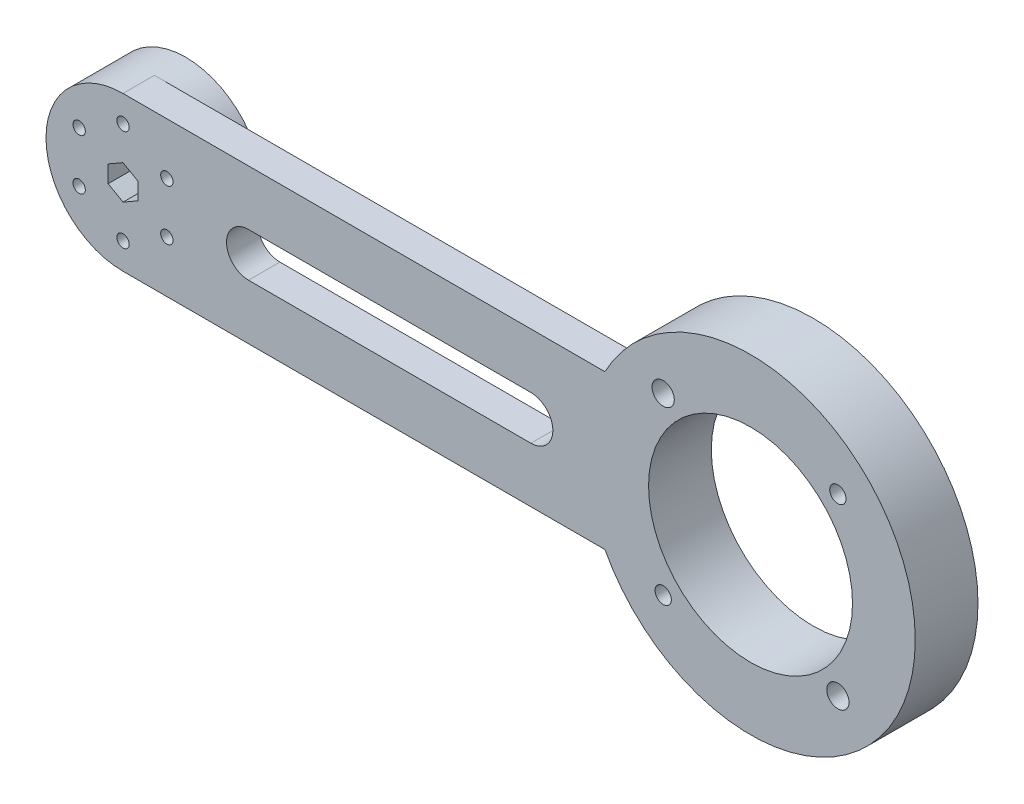
ISO-10303-21;
HEADER;
FILE_DESCRIPTION(('STEP AP214'),'2;1');
FILE_NAME('part.step','',(''),(''),'','','');
FILE_SCHEMA(('AUTOMOTIVE_DESIGN { 1 0 10303 214 1 1 1 1 }'));
ENDSEC;
DATA;
#1=APPLICATION_CONTEXT('core data for automotive mechanical design processes');
#2=APPLICATION_PROTOCOL_DEFINITION('international standard','automotive_design',2000,#1);
#3=PRODUCT_CONTEXT('',#1,'mechanical');
#4=PRODUCT('Part','Part','',(#3));
#5=PRODUCT_RELATED_PRODUCT_CATEGORY('part','',(#4));
#6=PRODUCT_DEFINITION_FORMATION('','',#4);
#7=PRODUCT_DEFINITION_CONTEXT('part definition',#1,'design');
#8=PRODUCT_DEFINITION('design','',#6,#7);
#9=PRODUCT_DEFINITION_SHAPE('','',#8);
#10=(LENGTH_UNIT() NAMED_UNIT(*) SI_UNIT(.MILLI.,.METRE.));
#11=(NAMED_UNIT(*) PLANE_ANGLE_UNIT() SI_UNIT($,.RADIAN.));
#12=(NAMED_UNIT(*) SI_UNIT($,.STERADIAN.) SOLID_ANGLE_UNIT());
#13=UNCERTAINTY_MEASURE_WITH_UNIT(LENGTH_MEASURE(1.E-05),#10,'distance_accuracy_value','');
#14=(GEOMETRIC_REPRESENTATION_CONTEXT(3) GLOBAL_UNCERTAINTY_ASSIGNED_CONTEXT((#13)) GLOBAL_UNIT_ASSIGNED_CONTEXT((#10,
#11,#12)) REPRESENTATION_CONTEXT('',''));
#15=CARTESIAN_POINT('',(0.,0.,0.));
#16=DIRECTION('',(0.,0.,1.));
#17=DIRECTION('',(1.,0.,0.));
#18=AXIS2_PLACEMENT_3D('',#15,#16,#17);
#19=CARTESIAN_POINT('',(6.18334947248386,-0.386154044925813,6.35));
#20=DIRECTION('',(0.,0.,-1.));
#21=DIRECTION('',(-1.,0.,0.));
#22=AXIS2_PLACEMENT_3D('',#19,#20,#21);
#23=CYLINDRICAL_SURFACE('',#22,4.445);
#24=CARTESIAN_POINT('',(6.18334947248386,-0.386154044925813,0.));
#25=DIRECTION('',(0.,0.,1.));
#26=DIRECTION('',(1.,0.,0.));
#27=AXIS2_PLACEMENT_3D('',#24,#25,#26);
#28=CIRCLE('',#27,4.445);
#29=CARTESIAN_POINT('',(6.18334947248386,-4.83115404492581,0.));
#30=VERTEX_POINT('',#29);
#31=CARTESIAN_POINT('',(6.18334947248386,4.05884595507418,0.));
#32=VERTEX_POINT('',#31);
#33=EDGE_CURVE('E193',#30,#32,#28,.T.);
#34=ORIENTED_EDGE('',*,*,#33,.F.);
#35=DIRECTION('',(0.,0.,-1.));
#36=VECTOR('',#35,1.);
#37=CARTESIAN_POINT('',(6.18334947248386,-4.83115404492581,6.35));
#38=LINE('',#37,#36);
#39=CARTESIAN_POINT('',(6.18334947248386,-4.83115404492581,6.35));
#40=VERTEX_POINT('',#39);
#41=EDGE_CURVE('E57',#40,#30,#38,.T.);
#42=ORIENTED_EDGE('',*,*,#41,.F.);
#43=CARTESIAN_POINT('',(6.18334947248386,-0.386154044925813,6.35));
#44=DIRECTION('',(0.,0.,1.));
#45=DIRECTION('',(1.,0.,0.));
#46=AXIS2_PLACEMENT_3D('',#43,#44,#45);
#47=CIRCLE('',#46,4.445);
#48=CARTESIAN_POINT('',(6.18334947248386,4.05884595507418,6.35));
#49=VERTEX_POINT('',#48);
#50=EDGE_CURVE('E153',#40,#49,#47,.T.);
#51=ORIENTED_EDGE('',*,*,#50,.T.);
#52=DIRECTION('',(0.,0.,-1.));
#53=VECTOR('',#52,1.);
#54=CARTESIAN_POINT('',(6.18334947248386,4.05884595507418,6.35));
#55=LINE('',#54,#53);
#56=EDGE_CURVE('E94',#49,#32,#55,.T.);
#57=ORIENTED_EDGE('',*,*,#56,.T.);
#58=EDGE_LOOP('',(#34,#42,#51,#57));
#59=FACE_BOUND('',#58,.T.);
#60=ADVANCED_FACE('F47',(#59),#23,.F.);
#61=CARTESIAN_POINT('',(0.,-4.83115404492581,6.35));
#62=DIRECTION('',(0.,1.,0.));
#63=DIRECTION('',(0.,0.,1.));
#64=AXIS2_PLACEMENT_3D('',#61,#62,#63);
#65=PLANE('',#64);
#66=DIRECTION('',(1.,0.,0.));
#67=VECTOR('',#66,1.);
#68=CARTESIAN_POINT('',(0.,-4.83115404492581,0.));
#69=LINE('',#68,#67);
#70=CARTESIAN_POINT('',(-50.9666505275162,-4.83115404492581,0.));
#71=VERTEX_POINT('',#70);
#72=EDGE_CURVE('E143',#71,#30,#69,.T.);
#73=ORIENTED_EDGE('',*,*,#72,.F.);
#74=DIRECTION('',(0.,0.,-1.));
#75=VECTOR('',#74,1.);
#76=CARTESIAN_POINT('',(-50.9666505275162,-4.83115404492581,6.35));
#77=LINE('',#76,#75);
#78=CARTESIAN_POINT('',(-50.9666505275162,-4.83115404492581,6.35));
#79=VERTEX_POINT('',#78);
#80=EDGE_CURVE('E138',#79,#71,#77,.T.);
#81=ORIENTED_EDGE('',*,*,#80,.F.);
#82=DIRECTION('',(1.,0.,0.));
#83=VECTOR('',#82,1.);
#84=CARTESIAN_POINT('',(0.,-4.83115404492581,6.35));
#85=LINE('',#84,#83);
#86=EDGE_CURVE('E141',#79,#40,#85,.T.);
#87=ORIENTED_EDGE('',*,*,#86,.T.);
#88=ORIENTED_EDGE('',*,*,#41,.T.);
#89=EDGE_LOOP('',(#73,#81,#87,#88));
#90=FACE_BOUND('',#89,.T.);
#91=ADVANCED_FACE('F140',(#90),#65,.T.);
#92=CARTESIAN_POINT('',(-50.9666505275162,-0.386154044925813,6.35));
#93=DIRECTION('',(0.,0.,-1.));
#94=DIRECTION('',(-1.,0.,0.));
#95=AXIS2_PLACEMENT_3D('',#92,#93,#94);
#96=CYLINDRICAL_SURFACE('',#95,4.445);
#97=CARTESIAN_POINT('',(-50.9666505275162,-0.386154044925813,0.));
#98=DIRECTION('',(0.,0.,1.));
#99=DIRECTION('',(1.,0.,0.));
#100=AXIS2_PLACEMENT_3D('',#97,#98,#99);
#101=CIRCLE('',#100,4.445);
#102=CARTESIAN_POINT('',(-50.9666505275162,4.05884595507418,0.));
#103=VERTEX_POINT('',#102);
#104=EDGE_CURVE('E199',#103,#71,#101,.T.);
#105=ORIENTED_EDGE('',*,*,#104,.F.);
#106=DIRECTION('',(0.,0.,-1.));
#107=VECTOR('',#106,1.);
#108=CARTESIAN_POINT('',(-50.9666505275162,4.05884595507418,6.35));
#109=LINE('',#108,#107);
#110=CARTESIAN_POINT('',(-50.9666505275162,4.05884595507418,6.35));
#111=VERTEX_POINT('',#110);
#112=EDGE_CURVE('E87',#111,#103,#109,.T.);
#113=ORIENTED_EDGE('',*,*,#112,.F.);
#114=CARTESIAN_POINT('',(-50.9666505275162,-0.386154044925813,6.35));
#115=DIRECTION('',(0.,0.,1.));
#116=DIRECTION('',(1.,0.,0.));
#117=AXIS2_PLACEMENT_3D('',#114,#115,#116);
#118=CIRCLE('',#117,4.445);
#119=EDGE_CURVE('E152',#111,#79,#118,.T.);
#120=ORIENTED_EDGE('',*,*,#119,.T.);
#121=ORIENTED_EDGE('',*,*,#80,.T.);
#122=EDGE_LOOP('',(#105,#113,#120,#121));
#123=FACE_BOUND('',#122,.T.);
#124=ADVANCED_FACE('F156',(#123),#96,.F.);
#125=CARTESIAN_POINT('',(-76.3666505275162,-0.386154044925813,6.35));
#126=DIRECTION('',(0.,0.,-1.));
#127=DIRECTION('',(-1.,0.,0.));
#128=AXIS2_PLACEMENT_3D('',#125,#126,#127);
#129=CYLINDRICAL_SURFACE('',#128,15.5847158734343);
#130=DIRECTION('',(0.,0.,-1.));
#131=VECTOR('',#130,1.);
#132=CARTESIAN_POINT('',(-76.3666505275162,15.1985618285085,6.35));
#133=LINE('',#132,#131);
#134=CARTESIAN_POINT('',(-76.3666505275162,15.1985618285085,6.35));
#135=VERTEX_POINT('',#134);
#136=CARTESIAN_POINT('',(-76.3666505275162,15.1985618285085,0.));
#137=VERTEX_POINT('',#136);
#138=EDGE_CURVE('E213',#135,#137,#133,.T.);
#139=ORIENTED_EDGE('',*,*,#138,.T.);
#140=CARTESIAN_POINT('',(-76.3666505275162,-0.386154044925813,0.));
#141=DIRECTION('',(0.,0.,1.));
#142=DIRECTION('',(1.,0.,0.));
#143=AXIS2_PLACEMENT_3D('',#140,#141,#142);
#144=CIRCLE('',#143,15.5847158734343);
#145=CARTESIAN_POINT('',(-76.3666505275162,-15.9708699183601,0.));
#146=VERTEX_POINT('',#145);
#147=EDGE_CURVE('E11',#146,#137,#144,.T.);
#148=ORIENTED_EDGE('',*,*,#147,.F.);
#149=DIRECTION('',(0.,0.,-1.));
#150=VECTOR('',#149,1.);
#151=CARTESIAN_POINT('',(-76.3666505275162,-15.9708699183601,6.35));
#152=LINE('',#151,#150);
#153=CARTESIAN_POINT('',(-76.3666505275162,-15.9708699183601,6.35));
#154=VERTEX_POINT('',#153);
#155=EDGE_CURVE('E208',#154,#146,#152,.T.);
#156=ORIENTED_EDGE('',*,*,#155,.F.);
#157=CARTESIAN_POINT('',(-76.3666505275162,-0.386154044925813,6.35));
#158=DIRECTION('',(0.,0.,1.));
#159=DIRECTION('',(1.,0.,0.));
#160=AXIS2_PLACEMENT_3D('',#157,#158,#159);
#161=CIRCLE('',#160,15.5847158734343);
#162=EDGE_CURVE('E368',#135,#154,#161,.T.);
#163=ORIENTED_EDGE('',*,*,#162,.F.);
#164=EDGE_LOOP('',(#139,#148,#156,#163));
#165=FACE_BOUND('',#164,.T.);
#166=CARTESIAN_POINT('',(-76.3666505275162,-0.386154044925813,-6.35));
#167=DIRECTION('',(0.,0.,1.));
#168=DIRECTION('',(1.,0.,0.));
#169=AXIS2_PLACEMENT_3D('',#166,#167,#168);
#170=CIRCLE('',#169,15.5847158734343);
#171=CARTESIAN_POINT('',(-60.7819346540819,-0.386154044925813,-6.35));
#172=VERTEX_POINT('',#171);
#173=EDGE_CURVE('E297',#172,#172,#170,.T.);
#174=ORIENTED_EDGE('',*,*,#173,.T.);
#175=EDGE_LOOP('',(#174));
#176=FACE_BOUND('',#175,.T.);
#177=ADVANCED_FACE('F416',(#165,#176),#129,.T.);
#178=CARTESIAN_POINT('',(0.,-15.9708699183601,6.35));
#179=DIRECTION('',(0.,1.,0.));
#180=DIRECTION('',(0.,0.,1.));
#181=AXIS2_PLACEMENT_3D('',#178,#179,#180);
#182=PLANE('',#181);
#183=DIRECTION('',(1.,0.,0.));
#184=VECTOR('',#183,1.);
#185=CARTESIAN_POINT('',(0.,-15.9708699183601,0.));
#186=LINE('',#185,#184);
#187=CARTESIAN_POINT('',(21.1629314674008,-15.9708699183601,0.));
#188=VERTEX_POINT('',#187);
#189=EDGE_CURVE('E184',#146,#188,#186,.T.);
#190=ORIENTED_EDGE('',*,*,#189,.T.);
#191=DIRECTION('',(0.,0.,-1.));
#192=VECTOR('',#191,1.);
#193=CARTESIAN_POINT('',(21.1629314674008,-15.9708699183601,6.35));
#194=LINE('',#193,#192);
#195=CARTESIAN_POINT('',(21.1629314674008,-15.9708699183601,6.35));
#196=VERTEX_POINT('',#195);
#197=EDGE_CURVE('E222',#196,#188,#194,.T.);
#198=ORIENTED_EDGE('',*,*,#197,.F.);
#199=DIRECTION('',(1.,0.,0.));
#200=VECTOR('',#199,1.);
#201=CARTESIAN_POINT('',(0.,-15.9708699183601,6.35));
#202=LINE('',#201,#200);
#203=EDGE_CURVE('E372',#154,#196,#202,.T.);
#204=ORIENTED_EDGE('',*,*,#203,.F.);
#205=ORIENTED_EDGE('',*,*,#155,.T.);
#206=EDGE_LOOP('',(#190,#198,#204,#205));
#207=FACE_BOUND('',#206,.T.);
#208=ADVANCED_FACE('F412',(#207),#182,.F.);
#209=CARTESIAN_POINT('',(50.6333494724839,-0.386154044925813,6.35));
#210=DIRECTION('',(0.,0.,-1.));
#211=DIRECTION('',(-1.,0.,0.));
#212=AXIS2_PLACEMENT_3D('',#209,#210,#211);
#213=CYLINDRICAL_SURFACE('',#212,33.3375);
#214=ORIENTED_EDGE('',*,*,#197,.T.);
#215=CARTESIAN_POINT('',(50.6333494724839,-0.386154044925813,0.));
#216=DIRECTION('',(0.,0.,1.));
#217=DIRECTION('',(1.,0.,0.));
#218=AXIS2_PLACEMENT_3D('',#215,#216,#217);
#219=CIRCLE('',#218,33.3375);
#220=CARTESIAN_POINT('',(21.1629314674008,15.1985618285085,0.));
#221=VERTEX_POINT('',#220);
#222=EDGE_CURVE('E301',#221,#188,#219,.T.);
#223=ORIENTED_EDGE('',*,*,#222,.F.);
#224=DIRECTION('',(0.,0.,-1.));
#225=VECTOR('',#224,1.);
#226=CARTESIAN_POINT('',(21.1629314674008,15.1985618285085,6.35));
#227=LINE('',#226,#225);
#228=CARTESIAN_POINT('',(21.1629314674008,15.1985618285085,6.35));
#229=VERTEX_POINT('',#228);
#230=EDGE_CURVE('E217',#229,#221,#227,.T.);
#231=ORIENTED_EDGE('',*,*,#230,.F.);
#232=CARTESIAN_POINT('',(50.6333494724839,-0.386154044925813,6.35));
#233=DIRECTION('',(0.,0.,1.));
#234=DIRECTION('',(1.,0.,0.));
#235=AXIS2_PLACEMENT_3D('',#232,#233,#234);
#236=CIRCLE('',#235,33.3375);
#237=EDGE_CURVE('E375',#196,#229,#236,.T.);
#238=ORIENTED_EDGE('',*,*,#237,.F.);
#239=EDGE_LOOP('',(#214,#223,#231,#238));
#240=FACE_BOUND('',#239,.T.);
#241=CARTESIAN_POINT('',(50.6333494724839,-0.386154044925813,-6.35));
#242=DIRECTION('',(0.,0.,1.));
#243=DIRECTION('',(1.,0.,0.));
#244=AXIS2_PLACEMENT_3D('',#241,#242,#243);
#245=CIRCLE('',#244,33.3375);
#246=CARTESIAN_POINT('',(83.9708494724838,-0.386154044925813,-6.35));
#247=VERTEX_POINT('',#246);
#248=EDGE_CURVE('E189',#247,#247,#245,.T.);
#249=ORIENTED_EDGE('',*,*,#248,.T.);
#250=EDGE_LOOP('',(#249));
#251=FACE_BOUND('',#250,.T.);
#252=ADVANCED_FACE('F409',(#240,#251),#213,.T.);
#253=CARTESIAN_POINT('',(-79.3666505275159,0.,6.35));
#254=DIRECTION('',(-1.,0.,0.));
#255=DIRECTION('',(0.,0.,1.));
#256=AXIS2_PLACEMENT_3D('',#253,#254,#255);
#257=PLANE('',#256);
#258=DIRECTION('',(0.,0.,-1.));
#259=VECTOR('',#258,1.);
#260=CARTESIAN_POINT('',(-79.3666505275159,-2.1182048524948,6.35));
#261=LINE('',#260,#259);
#262=CARTESIAN_POINT('',(-79.3666505275159,-2.1182048524948,6.35));
#263=VERTEX_POINT('',#262);
#264=CARTESIAN_POINT('',(-79.3666505275159,-2.1182048524948,-6.35));
#265=VERTEX_POINT('',#264);
#266=EDGE_CURVE('E183',#263,#265,#261,.T.);
#267=ORIENTED_EDGE('',*,*,#266,.T.);
#268=DIRECTION('',(0.,1.,0.));
#269=VECTOR('',#268,1.);
#270=CARTESIAN_POINT('',(-79.3666505275159,0.,-6.35));
#271=LINE('',#270,#269);
#272=CARTESIAN_POINT('',(-79.3666505275159,1.34589676264295,-6.35));
#273=VERTEX_POINT('',#272);
#274=EDGE_CURVE('E266',#265,#273,#271,.T.);
#275=ORIENTED_EDGE('',*,*,#274,.T.);
#276=DIRECTION('',(0.,0.,-1.));
#277=VECTOR('',#276,1.);
#278=CARTESIAN_POINT('',(-79.3666505275159,1.34589676264295,6.35));
#279=LINE('',#278,#277);
#280=CARTESIAN_POINT('',(-79.3666505275159,1.34589676264295,6.35));
#281=VERTEX_POINT('',#280);
#282=EDGE_CURVE('E218',#281,#273,#279,.T.);
#283=ORIENTED_EDGE('',*,*,#282,.F.);
#284=DIRECTION('',(0.,1.,0.));
#285=VECTOR('',#284,1.);
#286=CARTESIAN_POINT('',(-79.3666505275159,0.,6.35));
#287=LINE('',#286,#285);
#288=EDGE_CURVE('E351',#263,#281,#287,.T.);
#289=ORIENTED_EDGE('',*,*,#288,.F.);
#290=EDGE_LOOP('',(#267,#275,#283,#289));
#291=FACE_BOUND('',#290,.T.);
#292=ADVANCED_FACE('F273',(#291),#257,.F.);
#293=CARTESIAN_POINT('',(-20.4244530255391,35.3761903570375,6.35));
#294=DIRECTION('',(-0.500000000000001,0.866025403784438,0.));
#295=DIRECTION('',(-0.866025403784438,-0.500000000000002,0.));
#296=AXIS2_PLACEMENT_3D('',#293,#294,#295);
#297=PLANE('',#296);
#298=ORIENTED_EDGE('',*,*,#282,.T.);
#299=DIRECTION('',(0.866025403784438,0.500000000000001,0.));
#300=VECTOR('',#299,1.);
#301=CARTESIAN_POINT('',(-20.4244530255391,35.3761903570375,-6.35));
#302=LINE('',#301,#300);
#303=CARTESIAN_POINT('',(-76.3666505275159,3.07794757021184,-6.35));
#304=VERTEX_POINT('',#303);
#305=EDGE_CURVE('E254',#273,#304,#302,.T.);
#306=ORIENTED_EDGE('',*,*,#305,.T.);
#307=DIRECTION('',(0.,0.,-1.));
#308=VECTOR('',#307,1.);
#309=CARTESIAN_POINT('',(-76.3666505275159,3.07794757021184,6.35));
#310=LINE('',#309,#308);
#311=CARTESIAN_POINT('',(-76.3666505275159,3.07794757021184,6.35));
#312=VERTEX_POINT('',#311);
#313=EDGE_CURVE('E244',#312,#304,#310,.T.);
#314=ORIENTED_EDGE('',*,*,#313,.F.);
#315=DIRECTION('',(0.866025403784438,0.500000000000001,0.));
#316=VECTOR('',#315,1.);
#317=CARTESIAN_POINT('',(-20.4244530255391,35.3761903570375,6.35));
#318=LINE('',#317,#316);
#319=EDGE_CURVE('E102',#281,#312,#318,.T.);
#320=ORIENTED_EDGE('',*,*,#319,.F.);
#321=EDGE_LOOP('',(#298,#306,#314,#320));
#322=FACE_BOUND('',#321,.T.);
#323=ADVANCED_FACE('F252',(#322),#297,.F.);
#324=CARTESIAN_POINT('',(-17.7588722382191,-30.7592690017197,6.35));
#325=DIRECTION('',(0.500000000000001,0.866025403784438,0.));
#326=DIRECTION('',(-0.866025403784438,0.500000000000002,0.));
#327=AXIS2_PLACEMENT_3D('',#324,#325,#326);
#328=PLANE('',#327);
#329=ORIENTED_EDGE('',*,*,#313,.T.);
#330=DIRECTION('',(0.866025403784438,-0.500000000000001,0.));
#331=VECTOR('',#330,1.);
#332=CARTESIAN_POINT('',(-17.7588722382191,-30.7592690017197,-6.35));
#333=LINE('',#332,#331);
#334=CARTESIAN_POINT('',(-73.3666505275159,1.34589676264294,-6.35));
#335=VERTEX_POINT('',#334);
#336=EDGE_CURVE('E270',#304,#335,#333,.T.);
#337=ORIENTED_EDGE('',*,*,#336,.T.);
#338=DIRECTION('',(0.,0.,-1.));
#339=VECTOR('',#338,1.);
#340=CARTESIAN_POINT('',(-73.3666505275159,1.34589676264294,6.35));
#341=LINE('',#340,#339);
#342=CARTESIAN_POINT('',(-73.3666505275159,1.34589676264294,6.35));
#343=VERTEX_POINT('',#342);
#344=EDGE_CURVE('E240',#343,#335,#341,.T.);
#345=ORIENTED_EDGE('',*,*,#344,.F.);
#346=DIRECTION('',(0.866025403784438,-0.500000000000001,0.));
#347=VECTOR('',#346,1.);
#348=CARTESIAN_POINT('',(-17.7588722382191,-30.7592690017197,6.35));
#349=LINE('',#348,#347);
#350=EDGE_CURVE('E356',#312,#343,#349,.T.);
#351=ORIENTED_EDGE('',*,*,#350,.F.);
#352=EDGE_LOOP('',(#329,#337,#345,#351));
#353=FACE_BOUND('',#352,.T.);
#354=ADVANCED_FACE('F433',(#353),#328,.F.);
#355=CARTESIAN_POINT('',(-73.3666505275159,0.,6.35));
#356=DIRECTION('',(1.,0.,0.));
#357=DIRECTION('',(0.,0.,-1.));
#358=AXIS2_PLACEMENT_3D('',#355,#356,#357);
#359=PLANE('',#358);
#360=ORIENTED_EDGE('',*,*,#344,.T.);
#361=DIRECTION('',(0.,-1.,0.));
#362=VECTOR('',#361,1.);
#363=CARTESIAN_POINT('',(-73.3666505275159,0.,-6.35));
#364=LINE('',#363,#362);
#365=CARTESIAN_POINT('',(-73.3666505275159,-2.11820485249478,-6.35));
#366=VERTEX_POINT('',#365);
#367=EDGE_CURVE('E286',#335,#366,#364,.T.);
#368=ORIENTED_EDGE('',*,*,#367,.T.);
#369=DIRECTION('',(0.,0.,-1.));
#370=VECTOR('',#369,1.);
#371=CARTESIAN_POINT('',(-73.3666505275159,-2.11820485249478,6.35));
#372=LINE('',#371,#370);
#373=CARTESIAN_POINT('',(-73.3666505275159,-2.11820485249478,6.35));
#374=VERTEX_POINT('',#373);
#375=EDGE_CURVE('E236',#374,#366,#372,.T.);
#376=ORIENTED_EDGE('',*,*,#375,.F.);
#377=DIRECTION('',(0.,-1.,0.));
#378=VECTOR('',#377,1.);
#379=CARTESIAN_POINT('',(-73.3666505275159,0.,6.35));
#380=LINE('',#379,#378);
#381=EDGE_CURVE('E359',#343,#374,#380,.T.);
#382=ORIENTED_EDGE('',*,*,#381,.F.);
#383=EDGE_LOOP('',(#360,#368,#376,#382));
#384=FACE_BOUND('',#383,.T.);
#385=ADVANCED_FACE('F429',(#384),#359,.F.);
#386=CARTESIAN_POINT('',(-17.4244530255394,30.180037934331,6.35));
#387=DIRECTION('',(0.500000000000005,-0.866025403784436,0.));
#388=DIRECTION('',(0.866025403784436,0.500000000000005,0.));
#389=AXIS2_PLACEMENT_3D('',#386,#387,#388);
#390=PLANE('',#389);
#391=ORIENTED_EDGE('',*,*,#375,.T.);
#392=DIRECTION('',(-0.866025403784436,-0.500000000000005,0.));
#393=VECTOR('',#392,1.);
#394=CARTESIAN_POINT('',(-17.4244530255394,30.180037934331,-6.35));
#395=LINE('',#394,#393);
#396=CARTESIAN_POINT('',(-76.366650527516,-3.85025566006368,-6.35));
#397=VERTEX_POINT('',#396);
#398=EDGE_CURVE('E290',#366,#397,#395,.T.);
#399=ORIENTED_EDGE('',*,*,#398,.T.);
#400=DIRECTION('',(0.,0.,-1.));
#401=VECTOR('',#400,1.);
#402=CARTESIAN_POINT('',(-76.366650527516,-3.85025566006368,6.35));
#403=LINE('',#402,#401);
#404=CARTESIAN_POINT('',(-76.366650527516,-3.85025566006368,6.35));
#405=VERTEX_POINT('',#404);
#406=EDGE_CURVE('E232',#405,#397,#403,.T.);
#407=ORIENTED_EDGE('',*,*,#406,.F.);
#408=DIRECTION('',(-0.866025403784436,-0.500000000000005,0.));
#409=VECTOR('',#408,1.);
#410=CARTESIAN_POINT('',(-17.4244530255394,30.180037934331,6.35));
#411=LINE('',#410,#409);
#412=EDGE_CURVE('E362',#374,#405,#411,.T.);
#413=ORIENTED_EDGE('',*,*,#412,.F.);
#414=EDGE_LOOP('',(#391,#399,#407,#413));
#415=FACE_BOUND('',#414,.T.);
#416=ADVANCED_FACE('F425',(#415),#390,.F.);
#417=CARTESIAN_POINT('',(32.9556799428204,-18.0638235745896,6.35));
#418=DIRECTION('',(0.,0.,-1.));
#419=DIRECTION('',(-1.,0.,0.));
#420=AXIS2_PLACEMENT_3D('',#417,#418,#419);
#421=CYLINDRICAL_SURFACE('',#420,1.64999999999998);
#422=CARTESIAN_POINT('',(32.9556799428204,-18.0638235745896,6.35));
#423=DIRECTION('',(0.,0.,1.));
#424=DIRECTION('',(1.,0.,0.));
#425=AXIS2_PLACEMENT_3D('',#422,#423,#424);
#426=CIRCLE('',#425,1.64999999999998);
#427=CARTESIAN_POINT('',(34.6056799428204,-18.0638235745896,6.35));
#428=VERTEX_POINT('',#427);
#429=EDGE_CURVE('E175',#428,#428,#426,.T.);
#430=ORIENTED_EDGE('',*,*,#429,.T.);
#431=EDGE_LOOP('',(#430));
#432=FACE_BOUND('',#431,.T.);
#433=CARTESIAN_POINT('',(32.9556799428204,-18.0638235745896,-6.35));
#434=DIRECTION('',(0.,0.,1.));
#435=DIRECTION('',(1.,0.,0.));
#436=AXIS2_PLACEMENT_3D('',#433,#434,#435);
#437=CIRCLE('',#436,1.64999999999998);
#438=CARTESIAN_POINT('',(34.6056799428204,-18.0638235745896,-6.35));
#439=VERTEX_POINT('',#438);
#440=EDGE_CURVE('E314',#439,#439,#437,.T.);
#441=ORIENTED_EDGE('',*,*,#440,.F.);
#442=EDGE_LOOP('',(#441));
#443=FACE_BOUND('',#442,.T.);
#444=ADVANCED_FACE('F428',(#432,#443),#421,.F.);
#445=CARTESIAN_POINT('',(68.3110190021475,-18.0638235745898,6.35));
#446=DIRECTION('',(0.,0.,-1.));
#447=DIRECTION('',(-1.,0.,0.));
#448=AXIS2_PLACEMENT_3D('',#445,#446,#447);
#449=CYLINDRICAL_SURFACE('',#448,2.24999999999997);
#450=CARTESIAN_POINT('',(68.3110190021475,-18.0638235745898,6.35));
#451=DIRECTION('',(0.,0.,1.));
#452=DIRECTION('',(1.,0.,0.));
#453=AXIS2_PLACEMENT_3D('',#450,#451,#452);
#454=CIRCLE('',#453,2.24999999999997);
#455=CARTESIAN_POINT('',(70.5610190021475,-18.0638235745898,6.35));
#456=VERTEX_POINT('',#455);
#457=EDGE_CURVE('E171',#456,#456,#454,.T.);
#458=ORIENTED_EDGE('',*,*,#457,.T.);
#459=EDGE_LOOP('',(#458));
#460=FACE_BOUND('',#459,.T.);
#461=CARTESIAN_POINT('',(68.3110190021475,-18.0638235745898,-6.35));
#462=DIRECTION('',(0.,0.,1.));
#463=DIRECTION('',(1.,0.,0.));
#464=AXIS2_PLACEMENT_3D('',#461,#462,#463);
#465=CIRCLE('',#464,2.24999999999997);
#466=CARTESIAN_POINT('',(70.5610190021475,-18.0638235745898,-6.35));
#467=VERTEX_POINT('',#466);
#468=EDGE_CURVE('E310',#467,#467,#465,.T.);
#469=ORIENTED_EDGE('',*,*,#468,.F.);
#470=EDGE_LOOP('',(#469));
#471=FACE_BOUND('',#470,.T.);
#472=ADVANCED_FACE('F512',(#460,#471),#449,.F.);
#473=CARTESIAN_POINT('',(68.3110190021477,17.2915154847379,6.35));
#474=DIRECTION('',(0.,0.,-1.));
#475=DIRECTION('',(-1.,0.,0.));
#476=AXIS2_PLACEMENT_3D('',#473,#474,#475);
#477=CYLINDRICAL_SURFACE('',#476,1.65);
#478=CARTESIAN_POINT('',(68.3110190021477,17.2915154847379,6.35));
#479=DIRECTION('',(0.,0.,1.));
#480=DIRECTION('',(1.,0.,0.));
#481=AXIS2_PLACEMENT_3D('',#478,#479,#480);
#482=CIRCLE('',#481,1.65);
#483=CARTESIAN_POINT('',(69.9610190021477,17.2915154847379,6.35));
#484=VERTEX_POINT('',#483);
#485=EDGE_CURVE('E167',#484,#484,#482,.T.);
#486=ORIENTED_EDGE('',*,*,#485,.T.);
#487=EDGE_LOOP('',(#486));
#488=FACE_BOUND('',#487,.T.);
#489=CARTESIAN_POINT('',(68.3110190021477,17.2915154847379,-6.35));
#490=DIRECTION('',(0.,0.,1.));
#491=DIRECTION('',(1.,0.,0.));
#492=AXIS2_PLACEMENT_3D('',#489,#490,#491);
#493=CIRCLE('',#492,1.65);
#494=CARTESIAN_POINT('',(69.9610190021477,17.2915154847379,-6.35));
#495=VERTEX_POINT('',#494);
#496=EDGE_CURVE('E306',#495,#495,#493,.T.);
#497=ORIENTED_EDGE('',*,*,#496,.F.);
#498=EDGE_LOOP('',(#497));
#499=FACE_BOUND('',#498,.T.);
#500=ADVANCED_FACE('F398',(#488,#499),#477,.F.);
#501=CARTESIAN_POINT('',(32.9556799428205,17.2915154847379,6.35));
#502=DIRECTION('',(0.,0.,-1.));
#503=DIRECTION('',(-1.,0.,0.));
#504=AXIS2_PLACEMENT_3D('',#501,#502,#503);
#505=CYLINDRICAL_SURFACE('',#504,2.25);
#506=CARTESIAN_POINT('',(32.9556799428205,17.2915154847379,6.35));
#507=DIRECTION('',(0.,0.,1.));
#508=DIRECTION('',(1.,0.,0.));
#509=AXIS2_PLACEMENT_3D('',#506,#507,#508);
#510=CIRCLE('',#509,2.25);
#511=CARTESIAN_POINT('',(35.2056799428205,17.2915154847379,6.35));
#512=VERTEX_POINT('',#511);
#513=EDGE_CURVE('E160',#512,#512,#510,.T.);
#514=ORIENTED_EDGE('',*,*,#513,.T.);
#515=EDGE_LOOP('',(#514));
#516=FACE_BOUND('',#515,.T.);
#517=CARTESIAN_POINT('',(32.9556799428205,17.2915154847379,-6.35));
#518=DIRECTION('',(0.,0.,1.));
#519=DIRECTION('',(1.,0.,0.));
#520=AXIS2_PLACEMENT_3D('',#517,#518,#519);
#521=CIRCLE('',#520,2.25);
#522=CARTESIAN_POINT('',(35.2056799428205,17.2915154847379,-6.35));
#523=VERTEX_POINT('',#522);
#524=EDGE_CURVE('E302',#523,#523,#521,.T.);
#525=ORIENTED_EDGE('',*,*,#524,.F.);
#526=EDGE_LOOP('',(#525));
#527=FACE_BOUND('',#526,.T.);
#528=ADVANCED_FACE('F387',(#516,#527),#505,.F.);
#529=CARTESIAN_POINT('',(0.,4.05884595507418,6.35));
#530=DIRECTION('',(0.,1.,0.));
#531=DIRECTION('',(0.,0.,1.));
#532=AXIS2_PLACEMENT_3D('',#529,#530,#531);
#533=PLANE('',#532);
#534=DIRECTION('',(1.,0.,0.));
#535=VECTOR('',#534,1.);
#536=CARTESIAN_POINT('',(0.,4.05884595507418,0.));
#537=LINE('',#536,#535);
#538=EDGE_CURVE('E202',#103,#32,#537,.T.);
#539=ORIENTED_EDGE('',*,*,#538,.T.);
#540=ORIENTED_EDGE('',*,*,#56,.F.);
#541=DIRECTION('',(1.,0.,0.));
#542=VECTOR('',#541,1.);
#543=CARTESIAN_POINT('',(0.,4.05884595507418,6.35));
#544=LINE('',#543,#542);
#545=EDGE_CURVE('E65',#111,#49,#544,.T.);
#546=ORIENTED_EDGE('',*,*,#545,.F.);
#547=ORIENTED_EDGE('',*,*,#112,.T.);
#548=EDGE_LOOP('',(#539,#540,#546,#547));
#549=FACE_BOUND('',#548,.T.);
#550=ADVANCED_FACE('F384',(#549),#533,.F.);
#551=CARTESIAN_POINT('',(0.,15.1985618285085,6.35));
#552=DIRECTION('',(0.,1.,0.));
#553=DIRECTION('',(0.,0.,1.));
#554=AXIS2_PLACEMENT_3D('',#551,#552,#553);
#555=PLANE('',#554);
#556=DIRECTION('',(1.,0.,0.));
#557=VECTOR('',#556,1.);
#558=CARTESIAN_POINT('',(0.,15.1985618285085,0.));
#559=LINE('',#558,#557);
#560=EDGE_CURVE('E188',#137,#221,#559,.T.);
#561=ORIENTED_EDGE('',*,*,#560,.F.);
#562=ORIENTED_EDGE('',*,*,#138,.F.);
#563=DIRECTION('',(1.,0.,0.));
#564=VECTOR('',#563,1.);
#565=CARTESIAN_POINT('',(0.,15.1985618285085,6.35));
#566=LINE('',#565,#564);
#567=EDGE_CURVE('E378',#135,#229,#566,.T.);
#568=ORIENTED_EDGE('',*,*,#567,.T.);
#569=ORIENTED_EDGE('',*,*,#230,.T.);
#570=EDGE_LOOP('',(#561,#562,#568,#569));
#571=FACE_BOUND('',#570,.T.);
#572=ADVANCED_FACE('F386',(#571),#555,.T.);
#573=CARTESIAN_POINT('',(-20.758872238219,-35.9554214244263,6.35));
#574=DIRECTION('',(-0.5,-0.866025403784439,0.));
#575=DIRECTION('',(0.866025403784439,-0.5,0.));
#576=AXIS2_PLACEMENT_3D('',#573,#574,#575);
#577=PLANE('',#576);
#578=ORIENTED_EDGE('',*,*,#406,.T.);
#579=DIRECTION('',(-0.866025403784439,0.5,0.));
#580=VECTOR('',#579,1.);
#581=CARTESIAN_POINT('',(-20.758872238219,-35.9554214244263,-6.35));
#582=LINE('',#581,#580);
#583=EDGE_CURVE('E294',#397,#265,#582,.T.);
#584=ORIENTED_EDGE('',*,*,#583,.T.);
#585=ORIENTED_EDGE('',*,*,#266,.F.);
#586=DIRECTION('',(-0.866025403784439,0.5,0.));
#587=VECTOR('',#586,1.);
#588=CARTESIAN_POINT('',(-20.758872238219,-35.9554214244263,6.35));
#589=LINE('',#588,#587);
#590=EDGE_CURVE('E365',#405,#263,#589,.T.);
#591=ORIENTED_EDGE('',*,*,#590,.F.);
#592=EDGE_LOOP('',(#578,#584,#585,#591));
#593=FACE_BOUND('',#592,.T.);
#594=ADVANCED_FACE('F394',(#593),#577,.F.);
#595=CARTESIAN_POINT('',(-76.3666505275159,9.86384595507408,6.35));
#596=DIRECTION('',(0.,0.,-1.));
#597=DIRECTION('',(-1.,0.,0.));
#598=AXIS2_PLACEMENT_3D('',#595,#596,#597);
#599=CYLINDRICAL_SURFACE('',#598,1.25);
#600=CARTESIAN_POINT('',(-76.3666505275159,9.86384595507408,6.35));
#601=DIRECTION('',(0.,0.,1.));
#602=DIRECTION('',(1.,0.,0.));
#603=AXIS2_PLACEMENT_3D('',#600,#601,#602);
#604=CIRCLE('',#603,1.25);
#605=CARTESIAN_POINT('',(-75.1166505275159,9.86384595507408,6.35));
#606=VERTEX_POINT('',#605);
#607=EDGE_CURVE('E347',#606,#606,#604,.T.);
#608=ORIENTED_EDGE('',*,*,#607,.T.);
#609=EDGE_LOOP('',(#608));
#610=FACE_BOUND('',#609,.T.);
#611=CARTESIAN_POINT('',(-76.3666505275159,9.86384595507408,-6.35));
#612=DIRECTION('',(0.,0.,1.));
#613=DIRECTION('',(1.,0.,0.));
#614=AXIS2_PLACEMENT_3D('',#611,#612,#613);
#615=CIRCLE('',#614,1.25);
#616=CARTESIAN_POINT('',(-75.1166505275159,9.86384595507408,-6.35));
#617=VERTEX_POINT('',#616);
#618=EDGE_CURVE('E276',#617,#617,#615,.T.);
#619=ORIENTED_EDGE('',*,*,#618,.F.);
#620=EDGE_LOOP('',(#619));
#621=FACE_BOUND('',#620,.T.);
#622=ADVANCED_FACE('F423',(#610,#621),#599,.F.);
#623=CARTESIAN_POINT('',(-85.2434109163064,4.73884595507418,6.35));
#624=DIRECTION('',(0.,0.,-1.));
#625=DIRECTION('',(-1.,0.,0.));
#626=AXIS2_PLACEMENT_3D('',#623,#624,#625);
#627=CYLINDRICAL_SURFACE('',#626,1.24999999999998);
#628=CARTESIAN_POINT('',(-85.2434109163064,4.73884595507418,6.35));
#629=DIRECTION('',(0.,0.,1.));
#630=DIRECTION('',(1.,0.,0.));
#631=AXIS2_PLACEMENT_3D('',#628,#629,#630);
#632=CIRCLE('',#631,1.24999999999998);
#633=CARTESIAN_POINT('',(-83.9934109163064,4.73884595507418,6.35));
#634=VERTEX_POINT('',#633);
#635=EDGE_CURVE('E343',#634,#634,#632,.T.);
#636=ORIENTED_EDGE('',*,*,#635,.T.);
#637=EDGE_LOOP('',(#636));
#638=FACE_BOUND('',#637,.T.);
#639=CARTESIAN_POINT('',(-85.2434109163064,4.73884595507418,-6.35));
#640=DIRECTION('',(0.,0.,1.));
#641=DIRECTION('',(1.,0.,0.));
#642=AXIS2_PLACEMENT_3D('',#639,#640,#641);
#643=CIRCLE('',#642,1.24999999999998);
#644=CARTESIAN_POINT('',(-83.9934109163064,4.73884595507418,-6.35));
#645=VERTEX_POINT('',#644);
#646=EDGE_CURVE('E280',#645,#645,#643,.T.);
#647=ORIENTED_EDGE('',*,*,#646,.F.);
#648=EDGE_LOOP('',(#647));
#649=FACE_BOUND('',#648,.T.);
#650=ADVANCED_FACE('F444',(#638,#649),#627,.F.);
#651=CARTESIAN_POINT('',(-85.2434109163065,-5.51115404492584,6.35));
#652=DIRECTION('',(0.,0.,-1.));
#653=DIRECTION('',(-1.,0.,0.));
#654=AXIS2_PLACEMENT_3D('',#651,#652,#653);
#655=CYLINDRICAL_SURFACE('',#654,1.24999999999998);
#656=CARTESIAN_POINT('',(-85.2434109163065,-5.51115404492584,6.35));
#657=DIRECTION('',(0.,0.,1.));
#658=DIRECTION('',(1.,0.,0.));
#659=AXIS2_PLACEMENT_3D('',#656,#657,#658);
#660=CIRCLE('',#659,1.24999999999998);
#661=CARTESIAN_POINT('',(-83.9934109163065,-5.51115404492584,6.35));
#662=VERTEX_POINT('',#661);
#663=EDGE_CURVE('E339',#662,#662,#660,.T.);
#664=ORIENTED_EDGE('',*,*,#663,.T.);
#665=EDGE_LOOP('',(#664));
#666=FACE_BOUND('',#665,.T.);
#667=CARTESIAN_POINT('',(-85.2434109163065,-5.51115404492584,-6.35));
#668=DIRECTION('',(0.,0.,1.));
#669=DIRECTION('',(1.,0.,0.));
#670=AXIS2_PLACEMENT_3D('',#667,#668,#669);
#671=CIRCLE('',#670,1.24999999999998);
#672=CARTESIAN_POINT('',(-83.9934109163065,-5.51115404492584,-6.35));
#673=VERTEX_POINT('',#672);
#674=EDGE_CURVE('E477',#673,#673,#671,.T.);
#675=ORIENTED_EDGE('',*,*,#674,.F.);
#676=EDGE_LOOP('',(#675));
#677=FACE_BOUND('',#676,.T.);
#678=ADVANCED_FACE('F448',(#666,#677),#655,.F.);
#679=CARTESIAN_POINT('',(-76.366650527516,-10.6361540449259,6.35));
#680=DIRECTION('',(0.,0.,-1.));
#681=DIRECTION('',(-1.,0.,0.));
#682=AXIS2_PLACEMENT_3D('',#679,#680,#681);
#683=CYLINDRICAL_SURFACE('',#682,1.24999999999998);
#684=CARTESIAN_POINT('',(-76.366650527516,-10.6361540449259,6.35));
#685=DIRECTION('',(0.,0.,1.));
#686=DIRECTION('',(1.,0.,0.));
#687=AXIS2_PLACEMENT_3D('',#684,#685,#686);
#688=CIRCLE('',#687,1.24999999999998);
#689=CARTESIAN_POINT('',(-75.116650527516,-10.6361540449259,6.35));
#690=VERTEX_POINT('',#689);
#691=EDGE_CURVE('E335',#690,#690,#688,.T.);
#692=ORIENTED_EDGE('',*,*,#691,.T.);
#693=EDGE_LOOP('',(#692));
#694=FACE_BOUND('',#693,.T.);
#695=CARTESIAN_POINT('',(-76.366650527516,-10.6361540449259,-6.35));
#696=DIRECTION('',(0.,0.,1.));
#697=DIRECTION('',(1.,0.,0.));
#698=AXIS2_PLACEMENT_3D('',#695,#696,#697);
#699=CIRCLE('',#698,1.24999999999998);
#700=CARTESIAN_POINT('',(-75.116650527516,-10.6361540449259,-6.35));
#701=VERTEX_POINT('',#700);
#702=EDGE_CURVE('E471',#701,#701,#699,.T.);
#703=ORIENTED_EDGE('',*,*,#702,.F.);
#704=EDGE_LOOP('',(#703));
#705=FACE_BOUND('',#704,.T.);
#706=ADVANCED_FACE('F452',(#694,#705),#683,.F.);
#707=CARTESIAN_POINT('',(-67.4898901387254,-5.51115404492592,6.35));
#708=DIRECTION('',(0.,0.,-1.));
#709=DIRECTION('',(-1.,0.,0.));
#710=AXIS2_PLACEMENT_3D('',#707,#708,#709);
#711=CYLINDRICAL_SURFACE('',#710,1.24999999999998);
#712=CARTESIAN_POINT('',(-67.4898901387254,-5.51115404492592,6.35));
#713=DIRECTION('',(0.,0.,1.));
#714=DIRECTION('',(1.,0.,0.));
#715=AXIS2_PLACEMENT_3D('',#712,#713,#714);
#716=CIRCLE('',#715,1.24999999999998);
#717=CARTESIAN_POINT('',(-66.2398901387255,-5.51115404492592,6.35));
#718=VERTEX_POINT('',#717);
#719=EDGE_CURVE('E331',#718,#718,#716,.T.);
#720=ORIENTED_EDGE('',*,*,#719,.T.);
#721=EDGE_LOOP('',(#720));
#722=FACE_BOUND('',#721,.T.);
#723=CARTESIAN_POINT('',(-67.4898901387254,-5.51115404492592,-6.35));
#724=DIRECTION('',(0.,0.,1.));
#725=DIRECTION('',(1.,0.,0.));
#726=AXIS2_PLACEMENT_3D('',#723,#724,#725);
#727=CIRCLE('',#726,1.24999999999998);
#728=CARTESIAN_POINT('',(-66.2398901387255,-5.51115404492592,-6.35));
#729=VERTEX_POINT('',#728);
#730=EDGE_CURVE('E468',#729,#729,#727,.T.);
#731=ORIENTED_EDGE('',*,*,#730,.F.);
#732=EDGE_LOOP('',(#731));
#733=FACE_BOUND('',#732,.T.);
#734=ADVANCED_FACE('F455',(#722,#733),#711,.F.);
#735=CARTESIAN_POINT('',(-67.4898901387254,4.73884595507408,6.35));
#736=DIRECTION('',(0.,0.,-1.));
#737=DIRECTION('',(-1.,0.,0.));
#738=AXIS2_PLACEMENT_3D('',#735,#736,#737);
#739=CYLINDRICAL_SURFACE('',#738,1.24999999999998);
#740=CARTESIAN_POINT('',(-67.4898901387254,4.73884595507408,6.35));
#741=DIRECTION('',(0.,0.,1.));
#742=DIRECTION('',(1.,0.,0.));
#743=AXIS2_PLACEMENT_3D('',#740,#741,#742);
#744=CIRCLE('',#743,1.24999999999998);
#745=CARTESIAN_POINT('',(-66.2398901387254,4.73884595507408,6.35));
#746=VERTEX_POINT('',#745);
#747=EDGE_CURVE('E205',#746,#746,#744,.T.);
#748=ORIENTED_EDGE('',*,*,#747,.T.);
#749=EDGE_LOOP('',(#748));
#750=FACE_BOUND('',#749,.T.);
#751=CARTESIAN_POINT('',(-67.4898901387254,4.73884595507408,-6.35));
#752=DIRECTION('',(0.,0.,1.));
#753=DIRECTION('',(1.,0.,0.));
#754=AXIS2_PLACEMENT_3D('',#751,#752,#753);
#755=CIRCLE('',#754,1.24999999999998);
#756=CARTESIAN_POINT('',(-66.2398901387254,4.73884595507408,-6.35));
#757=VERTEX_POINT('',#756);
#758=EDGE_CURVE('E472',#757,#757,#755,.T.);
#759=ORIENTED_EDGE('',*,*,#758,.F.);
#760=EDGE_LOOP('',(#759));
#761=FACE_BOUND('',#760,.T.);
#762=ADVANCED_FACE('F49',(#750,#761),#739,.F.);
#763=CARTESIAN_POINT('',(50.6333494724839,-0.386154044925813,6.35));
#764=DIRECTION('',(0.,0.,-1.));
#765=DIRECTION('',(-1.,0.,0.));
#766=AXIS2_PLACEMENT_3D('',#763,#764,#765);
#767=CYLINDRICAL_SURFACE('',#766,20.6375);
#768=CARTESIAN_POINT('',(50.6333494724839,-0.386154044925813,6.35));
#769=DIRECTION('',(0.,0.,1.));
#770=DIRECTION('',(1.,0.,0.));
#771=AXIS2_PLACEMENT_3D('',#768,#769,#770);
#772=CIRCLE('',#771,20.6375);
#773=CARTESIAN_POINT('',(71.2708494724839,-0.386154044925813,6.35));
#774=VERTEX_POINT('',#773);
#775=EDGE_CURVE('E179',#774,#774,#772,.T.);
#776=ORIENTED_EDGE('',*,*,#775,.T.);
#777=EDGE_LOOP('',(#776));
#778=FACE_BOUND('',#777,.T.);
#779=CARTESIAN_POINT('',(50.6333494724839,-0.386154044925813,-6.35));
#780=DIRECTION('',(0.,0.,1.));
#781=DIRECTION('',(1.,0.,0.));
#782=AXIS2_PLACEMENT_3D('',#779,#780,#781);
#783=CIRCLE('',#782,20.6375);
#784=CARTESIAN_POINT('',(71.2708494724839,-0.386154044925813,-6.35));
#785=VERTEX_POINT('',#784);
#786=EDGE_CURVE('E318',#785,#785,#783,.T.);
#787=ORIENTED_EDGE('',*,*,#786,.F.);
#788=EDGE_LOOP('',(#787));
#789=FACE_BOUND('',#788,.T.);
#790=ADVANCED_FACE('F462',(#778,#789),#767,.F.);
#791=CARTESIAN_POINT('',(0.,0.,6.35));
#792=DIRECTION('',(0.,0.,1.));
#793=DIRECTION('',(1.,0.,0.));
#794=AXIS2_PLACEMENT_3D('',#791,#792,#793);
#795=PLANE('',#794);
#796=ORIENTED_EDGE('',*,*,#747,.F.);
#797=EDGE_LOOP('',(#796));
#798=FACE_BOUND('',#797,.T.);
#799=ORIENTED_EDGE('',*,*,#719,.F.);
#800=EDGE_LOOP('',(#799));
#801=FACE_BOUND('',#800,.T.);
#802=ORIENTED_EDGE('',*,*,#691,.F.);
#803=EDGE_LOOP('',(#802));
#804=FACE_BOUND('',#803,.T.);
#805=ORIENTED_EDGE('',*,*,#663,.F.);
#806=EDGE_LOOP('',(#805));
#807=FACE_BOUND('',#806,.T.);
#808=ORIENTED_EDGE('',*,*,#635,.F.);
#809=EDGE_LOOP('',(#808));
#810=FACE_BOUND('',#809,.T.);
#811=ORIENTED_EDGE('',*,*,#607,.F.);
#812=EDGE_LOOP('',(#811));
#813=FACE_BOUND('',#812,.T.);
#814=ORIENTED_EDGE('',*,*,#288,.T.);
#815=ORIENTED_EDGE('',*,*,#319,.T.);
#816=ORIENTED_EDGE('',*,*,#350,.T.);
#817=ORIENTED_EDGE('',*,*,#381,.T.);
#818=ORIENTED_EDGE('',*,*,#412,.T.);
#819=ORIENTED_EDGE('',*,*,#590,.T.);
#820=EDGE_LOOP('',(#814,#815,#816,#817,#818,#819));
#821=FACE_BOUND('',#820,.T.);
#822=ORIENTED_EDGE('',*,*,#162,.T.);
#823=ORIENTED_EDGE('',*,*,#203,.T.);
#824=ORIENTED_EDGE('',*,*,#237,.T.);
#825=ORIENTED_EDGE('',*,*,#567,.F.);
#826=EDGE_LOOP('',(#822,#823,#824,#825));
#827=FACE_BOUND('',#826,.T.);
#828=ORIENTED_EDGE('',*,*,#50,.F.);
#829=ORIENTED_EDGE('',*,*,#86,.F.);
#830=ORIENTED_EDGE('',*,*,#119,.F.);
#831=ORIENTED_EDGE('',*,*,#545,.T.);
#832=EDGE_LOOP('',(#828,#829,#830,#831));
#833=FACE_BOUND('',#832,.T.);
#834=ORIENTED_EDGE('',*,*,#513,.F.);
#835=EDGE_LOOP('',(#834));
#836=FACE_BOUND('',#835,.T.);
#837=ORIENTED_EDGE('',*,*,#485,.F.);
#838=EDGE_LOOP('',(#837));
#839=FACE_BOUND('',#838,.T.);
#840=ORIENTED_EDGE('',*,*,#457,.F.);
#841=EDGE_LOOP('',(#840));
#842=FACE_BOUND('',#841,.T.);
#843=ORIENTED_EDGE('',*,*,#429,.F.);
#844=EDGE_LOOP('',(#843));
#845=FACE_BOUND('',#844,.T.);
#846=ORIENTED_EDGE('',*,*,#775,.F.);
#847=EDGE_LOOP('',(#846));
#848=FACE_BOUND('',#847,.T.);
#849=ADVANCED_FACE('F150',(#798,#801,#804,#807,#810,#813,#821,#827,#833,#836,#839,#842,#845,
#848),#795,.T.);
#850=CARTESIAN_POINT('',(0.,0.,0.));
#851=DIRECTION('',(0.,0.,1.));
#852=DIRECTION('',(1.,0.,0.));
#853=AXIS2_PLACEMENT_3D('',#850,#851,#852);
#854=PLANE('',#853);
#855=ORIENTED_EDGE('',*,*,#189,.F.);
#856=ORIENTED_EDGE('',*,*,#147,.T.);
#857=ORIENTED_EDGE('',*,*,#560,.T.);
#858=ORIENTED_EDGE('',*,*,#222,.T.);
#859=EDGE_LOOP('',(#855,#856,#857,#858));
#860=FACE_BOUND('',#859,.T.);
#861=ORIENTED_EDGE('',*,*,#33,.T.);
#862=ORIENTED_EDGE('',*,*,#538,.F.);
#863=ORIENTED_EDGE('',*,*,#104,.T.);
#864=ORIENTED_EDGE('',*,*,#72,.T.);
#865=EDGE_LOOP('',(#861,#862,#863,#864));
#866=FACE_BOUND('',#865,.T.);
#867=ADVANCED_FACE('F383',(#860,#866),#854,.F.);
#868=CARTESIAN_POINT('',(0.,0.,-6.35));
#869=DIRECTION('',(0.,0.,1.));
#870=DIRECTION('',(1.,0.,0.));
#871=AXIS2_PLACEMENT_3D('',#868,#869,#870);
#872=PLANE('',#871);
#873=ORIENTED_EDGE('',*,*,#524,.T.);
#874=EDGE_LOOP('',(#873));
#875=FACE_BOUND('',#874,.T.);
#876=ORIENTED_EDGE('',*,*,#496,.T.);
#877=EDGE_LOOP('',(#876));
#878=FACE_BOUND('',#877,.T.);
#879=ORIENTED_EDGE('',*,*,#468,.T.);
#880=EDGE_LOOP('',(#879));
#881=FACE_BOUND('',#880,.T.);
#882=ORIENTED_EDGE('',*,*,#440,.T.);
#883=EDGE_LOOP('',(#882));
#884=FACE_BOUND('',#883,.T.);
#885=ORIENTED_EDGE('',*,*,#786,.T.);
#886=EDGE_LOOP('',(#885));
#887=FACE_BOUND('',#886,.T.);
#888=ORIENTED_EDGE('',*,*,#248,.F.);
#889=EDGE_LOOP('',(#888));
#890=FACE_BOUND('',#889,.T.);
#891=ADVANCED_FACE('F491',(#875,#878,#881,#884,#887,#890),#872,.F.);
#892=CARTESIAN_POINT('',(0.,0.,-6.35));
#893=DIRECTION('',(0.,0.,1.));
#894=DIRECTION('',(1.,0.,0.));
#895=AXIS2_PLACEMENT_3D('',#892,#893,#894);
#896=PLANE('',#895);
#897=ORIENTED_EDGE('',*,*,#758,.T.);
#898=EDGE_LOOP('',(#897));
#899=FACE_BOUND('',#898,.T.);
#900=ORIENTED_EDGE('',*,*,#730,.T.);
#901=EDGE_LOOP('',(#900));
#902=FACE_BOUND('',#901,.T.);
#903=ORIENTED_EDGE('',*,*,#702,.T.);
#904=EDGE_LOOP('',(#903));
#905=FACE_BOUND('',#904,.T.);
#906=ORIENTED_EDGE('',*,*,#674,.T.);
#907=EDGE_LOOP('',(#906));
#908=FACE_BOUND('',#907,.T.);
#909=ORIENTED_EDGE('',*,*,#646,.T.);
#910=EDGE_LOOP('',(#909));
#911=FACE_BOUND('',#910,.T.);
#912=ORIENTED_EDGE('',*,*,#618,.T.);
#913=EDGE_LOOP('',(#912));
#914=FACE_BOUND('',#913,.T.);
#915=ORIENTED_EDGE('',*,*,#274,.F.);
#916=ORIENTED_EDGE('',*,*,#583,.F.);
#917=ORIENTED_EDGE('',*,*,#398,.F.);
#918=ORIENTED_EDGE('',*,*,#367,.F.);
#919=ORIENTED_EDGE('',*,*,#336,.F.);
#920=ORIENTED_EDGE('',*,*,#305,.F.);
#921=EDGE_LOOP('',(#915,#916,#917,#918,#919,#920));
#922=FACE_BOUND('',#921,.T.);
#923=ORIENTED_EDGE('',*,*,#173,.F.);
#924=EDGE_LOOP('',(#923));
#925=FACE_BOUND('',#924,.T.);
#926=ADVANCED_FACE('F262',(#899,#902,#905,#908,#911,#914,#922,#925),#896,.F.);
#927=CLOSED_SHELL('',(#60,#91,#124,#177,#208,#252,#292,#323,#354,#385,#416,#444,#472,#500,#528,
#550,#572,#594,#622,#650,#678,#706,#734,#762,#790,#849,#867,#891,#926));
#928=MANIFOLD_SOLID_BREP('B2',#927);
#929=ADVANCED_BREP_SHAPE_REPRESENTATION('',(#18,#928),#14);
#930=SHAPE_DEFINITION_REPRESENTATION(#9,#929);
ENDSEC;
END-ISO-10303-21;
